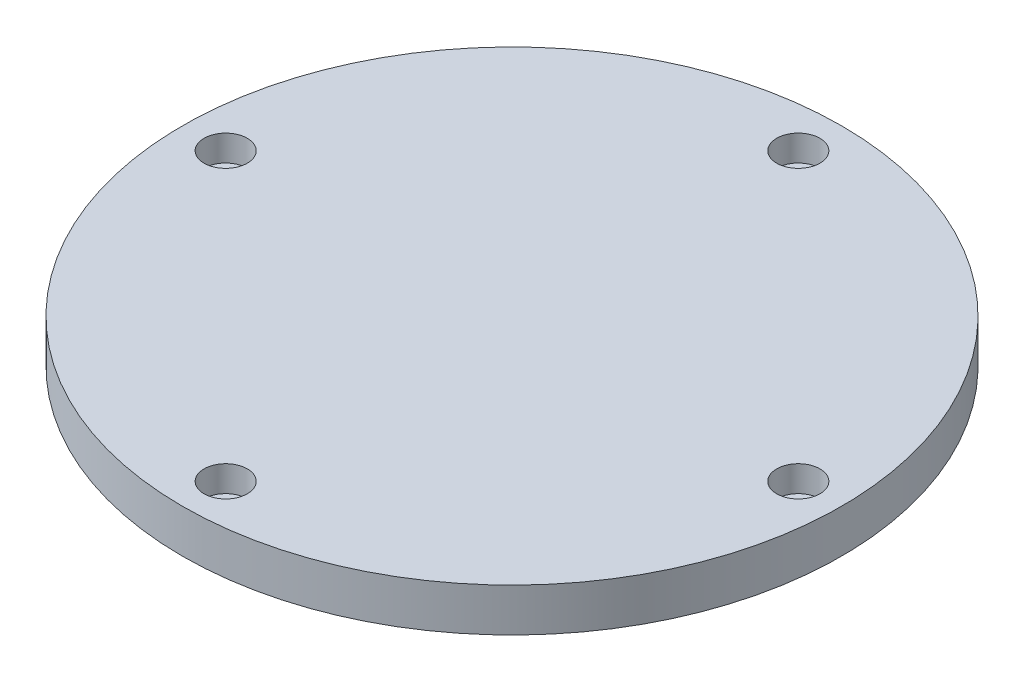
ISO-10303-21;
HEADER;
FILE_DESCRIPTION(('STEP AP214'),'2;1');
FILE_NAME('part.step','',(''),(''),'','','');
FILE_SCHEMA(('AUTOMOTIVE_DESIGN { 1 0 10303 214 1 1 1 1 }'));
ENDSEC;
DATA;
#1=APPLICATION_CONTEXT('core data for automotive mechanical design processes');
#2=APPLICATION_PROTOCOL_DEFINITION('international standard','automotive_design',2000,#1);
#3=PRODUCT_CONTEXT('',#1,'mechanical');
#4=PRODUCT('Part','Part','',(#3));
#5=PRODUCT_RELATED_PRODUCT_CATEGORY('part','',(#4));
#6=PRODUCT_DEFINITION_FORMATION('','',#4);
#7=PRODUCT_DEFINITION_CONTEXT('part definition',#1,'design');
#8=PRODUCT_DEFINITION('design','',#6,#7);
#9=PRODUCT_DEFINITION_SHAPE('','',#8);
#10=(LENGTH_UNIT() NAMED_UNIT(*) SI_UNIT(.MILLI.,.METRE.));
#11=(NAMED_UNIT(*) PLANE_ANGLE_UNIT() SI_UNIT($,.RADIAN.));
#12=(NAMED_UNIT(*) SI_UNIT($,.STERADIAN.) SOLID_ANGLE_UNIT());
#13=UNCERTAINTY_MEASURE_WITH_UNIT(LENGTH_MEASURE(1.E-05),#10,'distance_accuracy_value','');
#14=(GEOMETRIC_REPRESENTATION_CONTEXT(3) GLOBAL_UNCERTAINTY_ASSIGNED_CONTEXT((#13)) GLOBAL_UNIT_ASSIGNED_CONTEXT((#10,
#11,#12)) REPRESENTATION_CONTEXT('',''));
#15=CARTESIAN_POINT('',(0.,0.,0.));
#16=DIRECTION('',(0.,0.,1.));
#17=DIRECTION('',(1.,0.,0.));
#18=AXIS2_PLACEMENT_3D('',#15,#16,#17);
#19=CARTESIAN_POINT('',(0.,5.,0.));
#20=DIRECTION('',(0.,-1.,0.));
#21=DIRECTION('',(0.,0.,-1.));
#22=AXIS2_PLACEMENT_3D('',#19,#20,#21);
#23=CYLINDRICAL_SURFACE('',#22,38.1);
#24=CARTESIAN_POINT('',(0.,5.,0.));
#25=DIRECTION('',(0.,1.,0.));
#26=DIRECTION('',(0.,0.,1.));
#27=AXIS2_PLACEMENT_3D('',#24,#25,#26);
#28=CIRCLE('',#27,38.1);
#29=CARTESIAN_POINT('',(0.,5.,38.1));
#30=VERTEX_POINT('',#29);
#31=EDGE_CURVE('E10',#30,#30,#28,.T.);
#32=ORIENTED_EDGE('',*,*,#31,.F.);
#33=EDGE_LOOP('',(#32));
#34=FACE_BOUND('',#33,.T.);
#35=CARTESIAN_POINT('',(0.,0.,0.));
#36=DIRECTION('',(0.,1.,0.));
#37=DIRECTION('',(0.,0.,1.));
#38=AXIS2_PLACEMENT_3D('',#35,#36,#37);
#39=CIRCLE('',#38,38.1);
#40=CARTESIAN_POINT('',(0.,0.,38.1));
#41=VERTEX_POINT('',#40);
#42=EDGE_CURVE('E33',#41,#41,#39,.T.);
#43=ORIENTED_EDGE('',*,*,#42,.T.);
#44=EDGE_LOOP('',(#43));
#45=FACE_BOUND('',#44,.T.);
#46=ADVANCED_FACE('F30',(#34,#45),#23,.T.);
#47=CARTESIAN_POINT('',(0.,5.,0.));
#48=DIRECTION('',(0.,1.,0.));
#49=DIRECTION('',(0.,0.,1.));
#50=AXIS2_PLACEMENT_3D('',#47,#48,#49);
#51=PLANE('',#50);
#52=CARTESIAN_POINT('',(-33.1,5.,0.));
#53=DIRECTION('',(0.,1.,0.));
#54=DIRECTION('',(0.,0.,1.));
#55=AXIS2_PLACEMENT_3D('',#52,#53,#54);
#56=CIRCLE('',#55,2.5);
#57=CARTESIAN_POINT('',(-33.1,5.,2.5));
#58=VERTEX_POINT('',#57);
#59=EDGE_CURVE('E60',#58,#58,#56,.T.);
#60=ORIENTED_EDGE('',*,*,#59,.F.);
#61=EDGE_LOOP('',(#60));
#62=FACE_BOUND('',#61,.T.);
#63=CARTESIAN_POINT('',(0.,5.,33.1));
#64=DIRECTION('',(0.,1.,0.));
#65=DIRECTION('',(0.,0.,1.));
#66=AXIS2_PLACEMENT_3D('',#63,#64,#65);
#67=CIRCLE('',#66,2.5);
#68=CARTESIAN_POINT('',(0.,5.,35.6));
#69=VERTEX_POINT('',#68);
#70=EDGE_CURVE('E54',#69,#69,#67,.T.);
#71=ORIENTED_EDGE('',*,*,#70,.F.);
#72=EDGE_LOOP('',(#71));
#73=FACE_BOUND('',#72,.T.);
#74=CARTESIAN_POINT('',(33.1,5.,0.));
#75=DIRECTION('',(0.,1.,0.));
#76=DIRECTION('',(0.,0.,1.));
#77=AXIS2_PLACEMENT_3D('',#74,#75,#76);
#78=CIRCLE('',#77,2.5);
#79=CARTESIAN_POINT('',(33.1,5.,2.5));
#80=VERTEX_POINT('',#79);
#81=EDGE_CURVE('E48',#80,#80,#78,.T.);
#82=ORIENTED_EDGE('',*,*,#81,.F.);
#83=EDGE_LOOP('',(#82));
#84=FACE_BOUND('',#83,.T.);
#85=CARTESIAN_POINT('',(0.,5.,-33.1));
#86=DIRECTION('',(0.,1.,0.));
#87=DIRECTION('',(0.,0.,1.));
#88=AXIS2_PLACEMENT_3D('',#85,#86,#87);
#89=CIRCLE('',#88,2.5);
#90=CARTESIAN_POINT('',(0.,5.,-30.6));
#91=VERTEX_POINT('',#90);
#92=EDGE_CURVE('E42',#91,#91,#89,.T.);
#93=ORIENTED_EDGE('',*,*,#92,.F.);
#94=EDGE_LOOP('',(#93));
#95=FACE_BOUND('',#94,.T.);
#96=ORIENTED_EDGE('',*,*,#31,.T.);
#97=EDGE_LOOP('',(#96));
#98=FACE_BOUND('',#97,.T.);
#99=ADVANCED_FACE('F75',(#62,#73,#84,#95,#98),#51,.T.);
#100=CARTESIAN_POINT('',(0.,0.,0.));
#101=DIRECTION('',(0.,1.,0.));
#102=DIRECTION('',(0.,0.,1.));
#103=AXIS2_PLACEMENT_3D('',#100,#101,#102);
#104=PLANE('',#103);
#105=ORIENTED_EDGE('',*,*,#42,.F.);
#106=EDGE_LOOP('',(#105));
#107=FACE_BOUND('',#106,.T.);
#108=ADVANCED_FACE('F78',(#107),#104,.F.);
#109=CARTESIAN_POINT('',(0.,2.,-33.1));
#110=DIRECTION('',(0.,1.,0.));
#111=DIRECTION('',(0.,0.,1.));
#112=AXIS2_PLACEMENT_3D('',#109,#110,#111);
#113=CYLINDRICAL_SURFACE('',#112,2.5);
#114=CARTESIAN_POINT('',(0.,2.,-33.1));
#115=DIRECTION('',(0.,1.,0.));
#116=DIRECTION('',(0.,0.,1.));
#117=AXIS2_PLACEMENT_3D('',#114,#115,#116);
#118=CIRCLE('',#117,2.5);
#119=CARTESIAN_POINT('',(0.,2.,-30.6));
#120=VERTEX_POINT('',#119);
#121=EDGE_CURVE('E45',#120,#120,#118,.T.);
#122=ORIENTED_EDGE('',*,*,#121,.F.);
#123=EDGE_LOOP('',(#122));
#124=FACE_BOUND('',#123,.T.);
#125=ORIENTED_EDGE('',*,*,#92,.T.);
#126=EDGE_LOOP('',(#125));
#127=FACE_BOUND('',#126,.T.);
#128=ADVANCED_FACE('F86',(#124,#127),#113,.F.);
#129=CARTESIAN_POINT('',(0.,2.,-33.1));
#130=DIRECTION('',(0.,1.,0.));
#131=DIRECTION('',(0.,0.,1.));
#132=AXIS2_PLACEMENT_3D('',#129,#130,#131);
#133=PLANE('',#132);
#134=ORIENTED_EDGE('',*,*,#121,.T.);
#135=EDGE_LOOP('',(#134));
#136=FACE_BOUND('',#135,.T.);
#137=ADVANCED_FACE('F88',(#136),#133,.T.);
#138=CARTESIAN_POINT('',(33.1,2.,0.));
#139=DIRECTION('',(0.,1.,0.));
#140=DIRECTION('',(0.,0.,1.));
#141=AXIS2_PLACEMENT_3D('',#138,#139,#140);
#142=CYLINDRICAL_SURFACE('',#141,2.5);
#143=CARTESIAN_POINT('',(33.1,2.,0.));
#144=DIRECTION('',(0.,1.,0.));
#145=DIRECTION('',(0.,0.,1.));
#146=AXIS2_PLACEMENT_3D('',#143,#144,#145);
#147=CIRCLE('',#146,2.5);
#148=CARTESIAN_POINT('',(33.1,2.,2.5));
#149=VERTEX_POINT('',#148);
#150=EDGE_CURVE('E51',#149,#149,#147,.T.);
#151=ORIENTED_EDGE('',*,*,#150,.F.);
#152=EDGE_LOOP('',(#151));
#153=FACE_BOUND('',#152,.T.);
#154=ORIENTED_EDGE('',*,*,#81,.T.);
#155=EDGE_LOOP('',(#154));
#156=FACE_BOUND('',#155,.T.);
#157=ADVANCED_FACE('F95',(#153,#156),#142,.F.);
#158=CARTESIAN_POINT('',(33.1,2.,0.));
#159=DIRECTION('',(0.,1.,0.));
#160=DIRECTION('',(0.,0.,1.));
#161=AXIS2_PLACEMENT_3D('',#158,#159,#160);
#162=PLANE('',#161);
#163=ORIENTED_EDGE('',*,*,#150,.T.);
#164=EDGE_LOOP('',(#163));
#165=FACE_BOUND('',#164,.T.);
#166=ADVANCED_FACE('F135',(#165),#162,.T.);
#167=CARTESIAN_POINT('',(0.,2.,33.1));
#168=DIRECTION('',(0.,1.,0.));
#169=DIRECTION('',(0.,0.,1.));
#170=AXIS2_PLACEMENT_3D('',#167,#168,#169);
#171=CYLINDRICAL_SURFACE('',#170,2.5);
#172=CARTESIAN_POINT('',(0.,2.,33.1));
#173=DIRECTION('',(0.,1.,0.));
#174=DIRECTION('',(0.,0.,1.));
#175=AXIS2_PLACEMENT_3D('',#172,#173,#174);
#176=CIRCLE('',#175,2.5);
#177=CARTESIAN_POINT('',(0.,2.,35.6));
#178=VERTEX_POINT('',#177);
#179=EDGE_CURVE('E57',#178,#178,#176,.T.);
#180=ORIENTED_EDGE('',*,*,#179,.F.);
#181=EDGE_LOOP('',(#180));
#182=FACE_BOUND('',#181,.T.);
#183=ORIENTED_EDGE('',*,*,#70,.T.);
#184=EDGE_LOOP('',(#183));
#185=FACE_BOUND('',#184,.T.);
#186=ADVANCED_FACE('F144',(#182,#185),#171,.F.);
#187=CARTESIAN_POINT('',(0.,2.,33.1));
#188=DIRECTION('',(0.,1.,0.));
#189=DIRECTION('',(0.,0.,1.));
#190=AXIS2_PLACEMENT_3D('',#187,#188,#189);
#191=PLANE('',#190);
#192=ORIENTED_EDGE('',*,*,#179,.T.);
#193=EDGE_LOOP('',(#192));
#194=FACE_BOUND('',#193,.T.);
#195=ADVANCED_FACE('F71',(#194),#191,.T.);
#196=CARTESIAN_POINT('',(-33.1,2.,0.));
#197=DIRECTION('',(0.,1.,0.));
#198=DIRECTION('',(0.,0.,1.));
#199=AXIS2_PLACEMENT_3D('',#196,#197,#198);
#200=CYLINDRICAL_SURFACE('',#199,2.5);
#201=CARTESIAN_POINT('',(-33.1,2.,0.));
#202=DIRECTION('',(0.,1.,0.));
#203=DIRECTION('',(0.,0.,1.));
#204=AXIS2_PLACEMENT_3D('',#201,#202,#203);
#205=CIRCLE('',#204,2.5);
#206=CARTESIAN_POINT('',(-33.1,2.,2.5));
#207=VERTEX_POINT('',#206);
#208=EDGE_CURVE('E40',#207,#207,#205,.T.);
#209=ORIENTED_EDGE('',*,*,#208,.F.);
#210=EDGE_LOOP('',(#209));
#211=FACE_BOUND('',#210,.T.);
#212=ORIENTED_EDGE('',*,*,#59,.T.);
#213=EDGE_LOOP('',(#212));
#214=FACE_BOUND('',#213,.T.);
#215=ADVANCED_FACE('F68',(#211,#214),#200,.F.);
#216=CARTESIAN_POINT('',(-33.1,2.,0.));
#217=DIRECTION('',(0.,1.,0.));
#218=DIRECTION('',(0.,0.,1.));
#219=AXIS2_PLACEMENT_3D('',#216,#217,#218);
#220=PLANE('',#219);
#221=ORIENTED_EDGE('',*,*,#208,.T.);
#222=EDGE_LOOP('',(#221));
#223=FACE_BOUND('',#222,.T.);
#224=ADVANCED_FACE('F66',(#223),#220,.T.);
#225=CLOSED_SHELL('',(#46,#99,#108,#128,#137,#157,#166,#186,#195,#215,#224));
#226=MANIFOLD_SOLID_BREP('B2',#225);
#227=ADVANCED_BREP_SHAPE_REPRESENTATION('',(#18,#226),#14);
#228=SHAPE_DEFINITION_REPRESENTATION(#9,#227);
ENDSEC;
END-ISO-10303-21;
